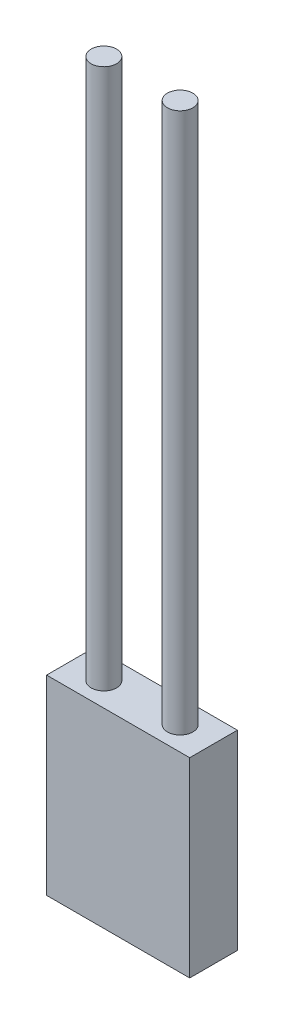
ISO-10303-21;
HEADER;
FILE_DESCRIPTION(('STEP AP214'),'2;1');
FILE_NAME('part.step','',(''),(''),'','','');
FILE_SCHEMA(('AUTOMOTIVE_DESIGN { 1 0 10303 214 1 1 1 1 }'));
ENDSEC;
DATA;
#1=APPLICATION_CONTEXT('core data for automotive mechanical design processes');
#2=APPLICATION_PROTOCOL_DEFINITION('international standard','automotive_design',2000,#1);
#3=PRODUCT_CONTEXT('',#1,'mechanical');
#4=PRODUCT('Part','Part','',(#3));
#5=PRODUCT_RELATED_PRODUCT_CATEGORY('part','',(#4));
#6=PRODUCT_DEFINITION_FORMATION('','',#4);
#7=PRODUCT_DEFINITION_CONTEXT('part definition',#1,'design');
#8=PRODUCT_DEFINITION('design','',#6,#7);
#9=PRODUCT_DEFINITION_SHAPE('','',#8);
#10=(LENGTH_UNIT() NAMED_UNIT(*) SI_UNIT(.MILLI.,.METRE.));
#11=(NAMED_UNIT(*) PLANE_ANGLE_UNIT() SI_UNIT($,.RADIAN.));
#12=(NAMED_UNIT(*) SI_UNIT($,.STERADIAN.) SOLID_ANGLE_UNIT());
#13=UNCERTAINTY_MEASURE_WITH_UNIT(LENGTH_MEASURE(1.E-05),#10,'distance_accuracy_value','');
#14=(GEOMETRIC_REPRESENTATION_CONTEXT(3) GLOBAL_UNCERTAINTY_ASSIGNED_CONTEXT((#13)) GLOBAL_UNIT_ASSIGNED_CONTEXT((#10,
#11,#12)) REPRESENTATION_CONTEXT('',''));
#15=CARTESIAN_POINT('',(0.,0.,0.));
#16=DIRECTION('',(0.,0.,1.));
#17=DIRECTION('',(1.,0.,0.));
#18=AXIS2_PLACEMENT_3D('',#15,#16,#17);
#19=CARTESIAN_POINT('',(22.5,-30.,7.5));
#20=DIRECTION('',(-1.,0.,0.));
#21=DIRECTION('',(0.,0.,1.));
#22=AXIS2_PLACEMENT_3D('',#19,#20,#21);
#23=PLANE('',#22);
#24=DIRECTION('',(0.,1.,0.));
#25=VECTOR('',#24,1.);
#26=CARTESIAN_POINT('',(22.5,-30.,-7.5));
#27=LINE('',#26,#25);
#28=CARTESIAN_POINT('',(22.5,-30.,-7.5));
#29=VERTEX_POINT('',#28);
#30=CARTESIAN_POINT('',(22.5,30.,-7.5));
#31=VERTEX_POINT('',#30);
#32=EDGE_CURVE('E111',#29,#31,#27,.T.);
#33=ORIENTED_EDGE('',*,*,#32,.T.);
#34=DIRECTION('',(0.,0.,-1.));
#35=VECTOR('',#34,1.);
#36=CARTESIAN_POINT('',(22.5,30.,7.5));
#37=LINE('',#36,#35);
#38=CARTESIAN_POINT('',(22.5,30.,7.5));
#39=VERTEX_POINT('',#38);
#40=EDGE_CURVE('E100',#39,#31,#37,.T.);
#41=ORIENTED_EDGE('',*,*,#40,.F.);
#42=DIRECTION('',(0.,1.,0.));
#43=VECTOR('',#42,1.);
#44=CARTESIAN_POINT('',(22.5,-30.,7.5));
#45=LINE('',#44,#43);
#46=CARTESIAN_POINT('',(22.5,-30.,7.5));
#47=VERTEX_POINT('',#46);
#48=EDGE_CURVE('E92',#47,#39,#45,.T.);
#49=ORIENTED_EDGE('',*,*,#48,.F.);
#50=DIRECTION('',(0.,0.,-1.));
#51=VECTOR('',#50,1.);
#52=CARTESIAN_POINT('',(22.5,-30.,7.5));
#53=LINE('',#52,#51);
#54=EDGE_CURVE('E107',#47,#29,#53,.T.);
#55=ORIENTED_EDGE('',*,*,#54,.T.);
#56=EDGE_LOOP('',(#33,#41,#49,#55));
#57=FACE_BOUND('',#56,.T.);
#58=ADVANCED_FACE('F39',(#57),#23,.F.);
#59=CARTESIAN_POINT('',(-22.5,30.,7.5));
#60=DIRECTION('',(0.,-1.,0.));
#61=DIRECTION('',(0.,0.,-1.));
#62=AXIS2_PLACEMENT_3D('',#59,#60,#61);
#63=PLANE('',#62);
#64=CARTESIAN_POINT('',(12.,30.,0.));
#65=DIRECTION('',(0.,-1.,0.));
#66=DIRECTION('',(0.,0.,-1.));
#67=AXIS2_PLACEMENT_3D('',#64,#65,#66);
#68=CIRCLE('',#67,4.);
#69=CARTESIAN_POINT('',(12.,30.,-4.));
#70=VERTEX_POINT('',#69);
#71=EDGE_CURVE('E11',#70,#70,#68,.F.);
#72=ORIENTED_EDGE('',*,*,#71,.F.);
#73=EDGE_LOOP('',(#72));
#74=FACE_BOUND('',#73,.T.);
#75=CARTESIAN_POINT('',(-12.,30.,0.));
#76=DIRECTION('',(0.,-1.,0.));
#77=DIRECTION('',(0.,0.,-1.));
#78=AXIS2_PLACEMENT_3D('',#75,#76,#77);
#79=CIRCLE('',#78,4.);
#80=CARTESIAN_POINT('',(-12.,30.,-4.));
#81=VERTEX_POINT('',#80);
#82=EDGE_CURVE('E48',#81,#81,#79,.F.);
#83=ORIENTED_EDGE('',*,*,#82,.F.);
#84=EDGE_LOOP('',(#83));
#85=FACE_BOUND('',#84,.T.);
#86=DIRECTION('',(-1.,0.,0.));
#87=VECTOR('',#86,1.);
#88=CARTESIAN_POINT('',(-22.5,30.,-7.5));
#89=LINE('',#88,#87);
#90=CARTESIAN_POINT('',(-22.5,30.,-7.5));
#91=VERTEX_POINT('',#90);
#92=EDGE_CURVE('E98',#31,#91,#89,.T.);
#93=ORIENTED_EDGE('',*,*,#92,.T.);
#94=DIRECTION('',(0.,0.,-1.));
#95=VECTOR('',#94,1.);
#96=CARTESIAN_POINT('',(-22.5,30.,7.5));
#97=LINE('',#96,#95);
#98=CARTESIAN_POINT('',(-22.5,30.,7.5));
#99=VERTEX_POINT('',#98);
#100=EDGE_CURVE('E96',#99,#91,#97,.T.);
#101=ORIENTED_EDGE('',*,*,#100,.F.);
#102=DIRECTION('',(-1.,0.,0.));
#103=VECTOR('',#102,1.);
#104=CARTESIAN_POINT('',(-22.5,30.,7.5));
#105=LINE('',#104,#103);
#106=EDGE_CURVE('E87',#39,#99,#105,.T.);
#107=ORIENTED_EDGE('',*,*,#106,.F.);
#108=ORIENTED_EDGE('',*,*,#40,.T.);
#109=EDGE_LOOP('',(#93,#101,#107,#108));
#110=FACE_BOUND('',#109,.T.);
#111=ADVANCED_FACE('F97',(#74,#85,#110),#63,.F.);
#112=CARTESIAN_POINT('',(-22.5,-30.,7.5));
#113=DIRECTION('',(1.,0.,0.));
#114=DIRECTION('',(0.,0.,-1.));
#115=AXIS2_PLACEMENT_3D('',#112,#113,#114);
#116=PLANE('',#115);
#117=DIRECTION('',(0.,-1.,0.));
#118=VECTOR('',#117,1.);
#119=CARTESIAN_POINT('',(-22.5,-30.,-7.5));
#120=LINE('',#119,#118);
#121=CARTESIAN_POINT('',(-22.5,-30.,-7.5));
#122=VERTEX_POINT('',#121);
#123=EDGE_CURVE('E73',#91,#122,#120,.T.);
#124=ORIENTED_EDGE('',*,*,#123,.T.);
#125=DIRECTION('',(0.,0.,-1.));
#126=VECTOR('',#125,1.);
#127=CARTESIAN_POINT('',(-22.5,-30.,7.5));
#128=LINE('',#127,#126);
#129=CARTESIAN_POINT('',(-22.5,-30.,7.5));
#130=VERTEX_POINT('',#129);
#131=EDGE_CURVE('E101',#130,#122,#128,.T.);
#132=ORIENTED_EDGE('',*,*,#131,.F.);
#133=DIRECTION('',(0.,-1.,0.));
#134=VECTOR('',#133,1.);
#135=CARTESIAN_POINT('',(-22.5,-30.,7.5));
#136=LINE('',#135,#134);
#137=EDGE_CURVE('E90',#99,#130,#136,.T.);
#138=ORIENTED_EDGE('',*,*,#137,.F.);
#139=ORIENTED_EDGE('',*,*,#100,.T.);
#140=EDGE_LOOP('',(#124,#132,#138,#139));
#141=FACE_BOUND('',#140,.T.);
#142=ADVANCED_FACE('F103',(#141),#116,.F.);
#143=CARTESIAN_POINT('',(-22.5,-30.,7.5));
#144=DIRECTION('',(0.,1.,0.));
#145=DIRECTION('',(0.,0.,1.));
#146=AXIS2_PLACEMENT_3D('',#143,#144,#145);
#147=PLANE('',#146);
#148=DIRECTION('',(1.,0.,0.));
#149=VECTOR('',#148,1.);
#150=CARTESIAN_POINT('',(-22.5,-30.,-7.5));
#151=LINE('',#150,#149);
#152=EDGE_CURVE('E79',#122,#29,#151,.T.);
#153=ORIENTED_EDGE('',*,*,#152,.T.);
#154=ORIENTED_EDGE('',*,*,#54,.F.);
#155=DIRECTION('',(1.,0.,0.));
#156=VECTOR('',#155,1.);
#157=CARTESIAN_POINT('',(-22.5,-30.,7.5));
#158=LINE('',#157,#156);
#159=EDGE_CURVE('E56',#130,#47,#158,.T.);
#160=ORIENTED_EDGE('',*,*,#159,.F.);
#161=ORIENTED_EDGE('',*,*,#131,.T.);
#162=EDGE_LOOP('',(#153,#154,#160,#161));
#163=FACE_BOUND('',#162,.T.);
#164=ADVANCED_FACE('F140',(#163),#147,.F.);
#165=CARTESIAN_POINT('',(0.,0.,7.5));
#166=DIRECTION('',(0.,0.,-1.));
#167=DIRECTION('',(-1.,0.,0.));
#168=AXIS2_PLACEMENT_3D('',#165,#166,#167);
#169=PLANE('',#168);
#170=ORIENTED_EDGE('',*,*,#48,.T.);
#171=ORIENTED_EDGE('',*,*,#106,.T.);
#172=ORIENTED_EDGE('',*,*,#137,.T.);
#173=ORIENTED_EDGE('',*,*,#159,.T.);
#174=EDGE_LOOP('',(#170,#171,#172,#173));
#175=FACE_BOUND('',#174,.T.);
#176=ADVANCED_FACE('F88',(#175),#169,.F.);
#177=CARTESIAN_POINT('',(0.,0.,-7.5));
#178=DIRECTION('',(0.,0.,-1.));
#179=DIRECTION('',(-1.,0.,0.));
#180=AXIS2_PLACEMENT_3D('',#177,#178,#179);
#181=PLANE('',#180);
#182=ORIENTED_EDGE('',*,*,#32,.F.);
#183=ORIENTED_EDGE('',*,*,#152,.F.);
#184=ORIENTED_EDGE('',*,*,#123,.F.);
#185=ORIENTED_EDGE('',*,*,#92,.F.);
#186=EDGE_LOOP('',(#182,#183,#184,#185));
#187=FACE_BOUND('',#186,.T.);
#188=ADVANCED_FACE('F147',(#187),#181,.T.);
#189=CARTESIAN_POINT('',(-12.,30.,0.));
#190=DIRECTION('',(0.,-1.,0.));
#191=DIRECTION('',(0.,0.,-1.));
#192=AXIS2_PLACEMENT_3D('',#189,#190,#191);
#193=CYLINDRICAL_SURFACE('',#192,4.);
#194=ORIENTED_EDGE('',*,*,#82,.T.);
#195=EDGE_LOOP('',(#194));
#196=FACE_BOUND('',#195,.T.);
#197=CARTESIAN_POINT('',(-12.,200.,0.));
#198=DIRECTION('',(0.,-1.,0.));
#199=DIRECTION('',(0.,0.,-1.));
#200=AXIS2_PLACEMENT_3D('',#197,#198,#199);
#201=CIRCLE('',#200,4.);
#202=CARTESIAN_POINT('',(-12.,200.,-4.));
#203=VERTEX_POINT('',#202);
#204=EDGE_CURVE('E115',#203,#203,#201,.T.);
#205=ORIENTED_EDGE('',*,*,#204,.T.);
#206=EDGE_LOOP('',(#205));
#207=FACE_BOUND('',#206,.T.);
#208=ADVANCED_FACE('F131',(#196,#207),#193,.T.);
#209=CARTESIAN_POINT('',(-16.,200.,0.));
#210=DIRECTION('',(0.,-1.,0.));
#211=DIRECTION('',(0.,0.,-1.));
#212=AXIS2_PLACEMENT_3D('',#209,#210,#211);
#213=PLANE('',#212);
#214=ORIENTED_EDGE('',*,*,#204,.F.);
#215=EDGE_LOOP('',(#214));
#216=FACE_BOUND('',#215,.T.);
#217=ADVANCED_FACE('F155',(#216),#213,.F.);
#218=CARTESIAN_POINT('',(12.,30.,0.));
#219=DIRECTION('',(0.,-1.,0.));
#220=DIRECTION('',(0.,0.,-1.));
#221=AXIS2_PLACEMENT_3D('',#218,#219,#220);
#222=CYLINDRICAL_SURFACE('',#221,4.);
#223=ORIENTED_EDGE('',*,*,#71,.T.);
#224=EDGE_LOOP('',(#223));
#225=FACE_BOUND('',#224,.T.);
#226=CARTESIAN_POINT('',(12.,200.,0.));
#227=DIRECTION('',(0.,1.,0.));
#228=DIRECTION('',(0.,0.,-1.));
#229=AXIS2_PLACEMENT_3D('',#226,#227,#228);
#230=CIRCLE('',#229,4.);
#231=CARTESIAN_POINT('',(12.,200.,-4.));
#232=VERTEX_POINT('',#231);
#233=EDGE_CURVE('E170',#232,#232,#230,.T.);
#234=ORIENTED_EDGE('',*,*,#233,.F.);
#235=EDGE_LOOP('',(#234));
#236=FACE_BOUND('',#235,.T.);
#237=ADVANCED_FACE('F158',(#225,#236),#222,.T.);
#238=CARTESIAN_POINT('',(16.,200.,0.));
#239=DIRECTION('',(0.,-1.,0.));
#240=DIRECTION('',(0.,0.,-1.));
#241=AXIS2_PLACEMENT_3D('',#238,#239,#240);
#242=PLANE('',#241);
#243=ORIENTED_EDGE('',*,*,#233,.T.);
#244=EDGE_LOOP('',(#243));
#245=FACE_BOUND('',#244,.T.);
#246=ADVANCED_FACE('F162',(#245),#242,.F.);
#247=CLOSED_SHELL('',(#58,#111,#142,#164,#176,#188,#208,#217,#237,#246));
#248=MANIFOLD_SOLID_BREP('B2',#247);
#249=ADVANCED_BREP_SHAPE_REPRESENTATION('',(#18,#248),#14);
#250=SHAPE_DEFINITION_REPRESENTATION(#9,#249);
ENDSEC;
END-ISO-10303-21;
